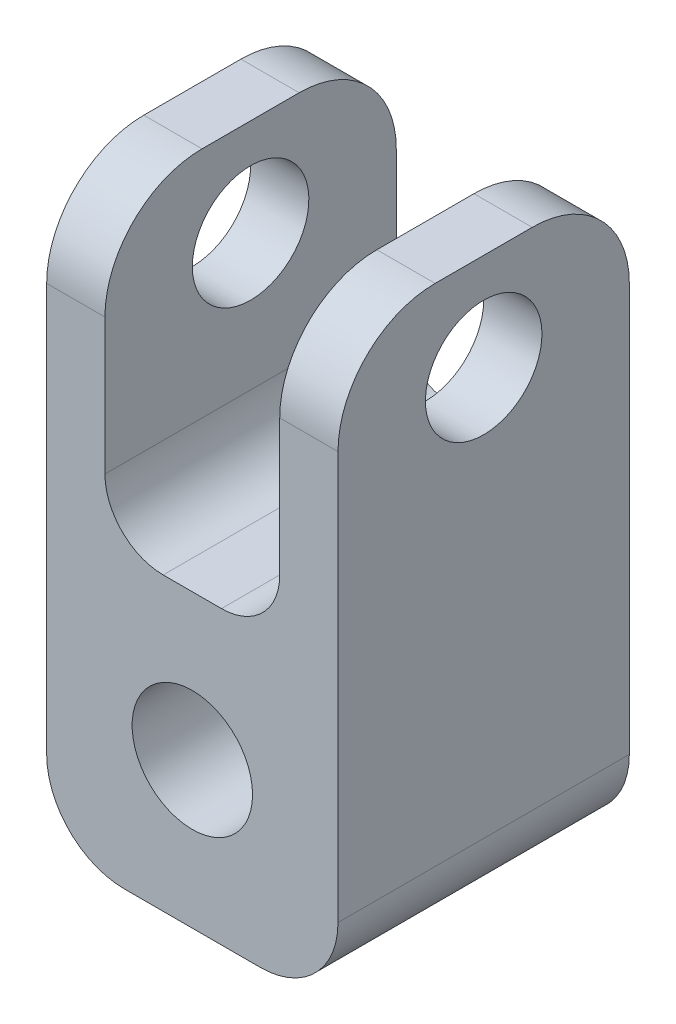
ISO-10303-21;
HEADER;
FILE_DESCRIPTION(('STEP AP214'),'2;1');
FILE_NAME('part.step','',(''),(''),'','','');
FILE_SCHEMA(('AUTOMOTIVE_DESIGN { 1 0 10303 214 1 1 1 1 }'));
ENDSEC;
DATA;
#1=APPLICATION_CONTEXT('core data for automotive mechanical design processes');
#2=APPLICATION_PROTOCOL_DEFINITION('international standard','automotive_design',2000,#1);
#3=PRODUCT_CONTEXT('',#1,'mechanical');
#4=PRODUCT('Part','Part','',(#3));
#5=PRODUCT_RELATED_PRODUCT_CATEGORY('part','',(#4));
#6=PRODUCT_DEFINITION_FORMATION('','',#4);
#7=PRODUCT_DEFINITION_CONTEXT('part definition',#1,'design');
#8=PRODUCT_DEFINITION('design','',#6,#7);
#9=PRODUCT_DEFINITION_SHAPE('','',#8);
#10=(LENGTH_UNIT() NAMED_UNIT(*) SI_UNIT(.MILLI.,.METRE.));
#11=(NAMED_UNIT(*) PLANE_ANGLE_UNIT() SI_UNIT($,.RADIAN.));
#12=(NAMED_UNIT(*) SI_UNIT($,.STERADIAN.) SOLID_ANGLE_UNIT());
#13=UNCERTAINTY_MEASURE_WITH_UNIT(LENGTH_MEASURE(1.E-05),#10,'distance_accuracy_value','');
#14=(GEOMETRIC_REPRESENTATION_CONTEXT(3) GLOBAL_UNCERTAINTY_ASSIGNED_CONTEXT((#13)) GLOBAL_UNIT_ASSIGNED_CONTEXT((#10,
#11,#12)) REPRESENTATION_CONTEXT('',''));
#15=CARTESIAN_POINT('',(0.,0.,0.));
#16=DIRECTION('',(0.,0.,1.));
#17=DIRECTION('',(1.,0.,0.));
#18=AXIS2_PLACEMENT_3D('',#15,#16,#17);
#19=CARTESIAN_POINT('',(-15.,15.,30.));
#20=DIRECTION('',(0.,-1.,0.));
#21=DIRECTION('',(0.,0.,-1.));
#22=AXIS2_PLACEMENT_3D('',#19,#20,#21);
#23=PLANE('',#22);
#24=DIRECTION('',(-1.,0.,0.));
#25=VECTOR('',#24,1.);
#26=CARTESIAN_POINT('',(-15.,15.,30.));
#27=LINE('',#26,#25);
#28=CARTESIAN_POINT('',(3.,15.,30.));
#29=VERTEX_POINT('',#28);
#30=CARTESIAN_POINT('',(-3.,15.,30.));
#31=VERTEX_POINT('',#30);
#32=EDGE_CURVE('E276',#29,#31,#27,.T.);
#33=ORIENTED_EDGE('',*,*,#32,.F.);
#34=DIRECTION('',(0.,0.,1.));
#35=VECTOR('',#34,1.);
#36=CARTESIAN_POINT('',(2.99999999999999,15.,0.));
#37=LINE('',#36,#35);
#38=CARTESIAN_POINT('',(2.99999999999999,15.,0.));
#39=VERTEX_POINT('',#38);
#40=EDGE_CURVE('E247',#29,#39,#37,.F.);
#41=ORIENTED_EDGE('',*,*,#40,.T.);
#42=DIRECTION('',(-1.,0.,0.));
#43=VECTOR('',#42,1.);
#44=CARTESIAN_POINT('',(-15.,15.,0.));
#45=LINE('',#44,#43);
#46=CARTESIAN_POINT('',(-3.,15.,0.));
#47=VERTEX_POINT('',#46);
#48=EDGE_CURVE('E175',#39,#47,#45,.T.);
#49=ORIENTED_EDGE('',*,*,#48,.T.);
#50=DIRECTION('',(0.,0.,-1.));
#51=VECTOR('',#50,1.);
#52=CARTESIAN_POINT('',(-3.,15.,30.));
#53=LINE('',#52,#51);
#54=EDGE_CURVE('E245',#47,#31,#53,.F.);
#55=ORIENTED_EDGE('',*,*,#54,.T.);
#56=EDGE_LOOP('',(#33,#41,#49,#55));
#57=FACE_BOUND('',#56,.T.);
#58=ADVANCED_FACE('F33',(#57),#23,.F.);
#59=CARTESIAN_POINT('',(0.,0.,30.));
#60=DIRECTION('',(0.,0.,1.));
#61=DIRECTION('',(1.,0.,0.));
#62=AXIS2_PLACEMENT_3D('',#59,#60,#61);
#63=PLANE('',#62);
#64=DIRECTION('',(0.,1.,0.));
#65=VECTOR('',#64,1.);
#66=CARTESIAN_POINT('',(15.,15.,30.));
#67=LINE('',#66,#65);
#68=CARTESIAN_POINT('',(15.,-7.,30.));
#69=VERTEX_POINT('',#68);
#70=CARTESIAN_POINT('',(15.,35.,30.));
#71=VERTEX_POINT('',#70);
#72=EDGE_CURVE('E167',#69,#71,#67,.T.);
#73=ORIENTED_EDGE('',*,*,#72,.T.);
#74=DIRECTION('',(1.,0.,0.));
#75=VECTOR('',#74,1.);
#76=CARTESIAN_POINT('',(0.,35.,30.));
#77=LINE('',#76,#75);
#78=CARTESIAN_POINT('',(9.,35.,30.));
#79=VERTEX_POINT('',#78);
#80=EDGE_CURVE('E214',#71,#79,#77,.F.);
#81=ORIENTED_EDGE('',*,*,#80,.T.);
#82=DIRECTION('',(0.,-1.,0.));
#83=VECTOR('',#82,1.);
#84=CARTESIAN_POINT('',(9.,45.,30.));
#85=LINE('',#84,#83);
#86=CARTESIAN_POINT('',(9.,21.,30.));
#87=VERTEX_POINT('',#86);
#88=EDGE_CURVE('E303',#79,#87,#85,.T.);
#89=ORIENTED_EDGE('',*,*,#88,.T.);
#90=CARTESIAN_POINT('',(3.,21.,30.));
#91=DIRECTION('',(0.,0.,1.));
#92=DIRECTION('',(1.,0.,0.));
#93=AXIS2_PLACEMENT_3D('',#90,#91,#92);
#94=CIRCLE('',#93,6.);
#95=EDGE_CURVE('E251',#87,#29,#94,.F.);
#96=ORIENTED_EDGE('',*,*,#95,.T.);
#97=ORIENTED_EDGE('',*,*,#32,.T.);
#98=CARTESIAN_POINT('',(-3.,21.,30.));
#99=DIRECTION('',(0.,0.,1.));
#100=DIRECTION('',(1.,0.,0.));
#101=AXIS2_PLACEMENT_3D('',#98,#99,#100);
#102=CIRCLE('',#101,6.);
#103=CARTESIAN_POINT('',(-9.00000000000001,21.,30.));
#104=VERTEX_POINT('',#103);
#105=EDGE_CURVE('E11',#31,#104,#102,.F.);
#106=ORIENTED_EDGE('',*,*,#105,.T.);
#107=DIRECTION('',(0.,-1.,0.));
#108=VECTOR('',#107,1.);
#109=CARTESIAN_POINT('',(-9.00000000000001,45.,30.));
#110=LINE('',#109,#108);
#111=CARTESIAN_POINT('',(-9.00000000000001,35.,30.));
#112=VERTEX_POINT('',#111);
#113=EDGE_CURVE('E265',#112,#104,#110,.T.);
#114=ORIENTED_EDGE('',*,*,#113,.F.);
#115=DIRECTION('',(1.,0.,0.));
#116=VECTOR('',#115,1.);
#117=CARTESIAN_POINT('',(0.,35.,30.));
#118=LINE('',#117,#116);
#119=CARTESIAN_POINT('',(-15.,35.,30.));
#120=VERTEX_POINT('',#119);
#121=EDGE_CURVE('E212',#112,#120,#118,.F.);
#122=ORIENTED_EDGE('',*,*,#121,.T.);
#123=DIRECTION('',(0.,-1.,0.));
#124=VECTOR('',#123,1.);
#125=CARTESIAN_POINT('',(-15.,15.,30.));
#126=LINE('',#125,#124);
#127=CARTESIAN_POINT('',(-15.,-7.,30.));
#128=VERTEX_POINT('',#127);
#129=EDGE_CURVE('E277',#120,#128,#126,.T.);
#130=ORIENTED_EDGE('',*,*,#129,.T.);
#131=CARTESIAN_POINT('',(-7.,-7.,30.));
#132=DIRECTION('',(0.,0.,1.));
#133=DIRECTION('',(1.,0.,0.));
#134=AXIS2_PLACEMENT_3D('',#131,#132,#133);
#135=CIRCLE('',#134,8.);
#136=CARTESIAN_POINT('',(-7.,-15.,30.));
#137=VERTEX_POINT('',#136);
#138=EDGE_CURVE('E195',#128,#137,#135,.T.);
#139=ORIENTED_EDGE('',*,*,#138,.T.);
#140=DIRECTION('',(1.,0.,0.));
#141=VECTOR('',#140,1.);
#142=CARTESIAN_POINT('',(-15.,-15.,30.));
#143=LINE('',#142,#141);
#144=CARTESIAN_POINT('',(7.,-15.,30.));
#145=VERTEX_POINT('',#144);
#146=EDGE_CURVE('E168',#137,#145,#143,.T.);
#147=ORIENTED_EDGE('',*,*,#146,.T.);
#148=CARTESIAN_POINT('',(7.,-7.,30.));
#149=DIRECTION('',(0.,0.,1.));
#150=DIRECTION('',(1.,0.,0.));
#151=AXIS2_PLACEMENT_3D('',#148,#149,#150);
#152=CIRCLE('',#151,8.);
#153=EDGE_CURVE('E197',#145,#69,#152,.T.);
#154=ORIENTED_EDGE('',*,*,#153,.T.);
#155=EDGE_LOOP('',(#73,#81,#89,#96,#97,#106,#114,#122,#130,#139,#147,#154));
#156=FACE_BOUND('',#155,.T.);
#157=CARTESIAN_POINT('',(0.,0.,30.));
#158=DIRECTION('',(0.,0.,1.));
#159=DIRECTION('',(1.,0.,0.));
#160=AXIS2_PLACEMENT_3D('',#157,#158,#159);
#161=CIRCLE('',#160,6.2);
#162=CARTESIAN_POINT('',(6.19999999999999,0.,30.));
#163=VERTEX_POINT('',#162);
#164=EDGE_CURVE('E176',#163,#163,#161,.T.);
#165=ORIENTED_EDGE('',*,*,#164,.F.);
#166=EDGE_LOOP('',(#165));
#167=FACE_BOUND('',#166,.T.);
#168=ADVANCED_FACE('F281',(#156,#167),#63,.T.);
#169=CARTESIAN_POINT('',(0.,0.,0.));
#170=DIRECTION('',(0.,0.,1.));
#171=DIRECTION('',(1.,0.,0.));
#172=AXIS2_PLACEMENT_3D('',#169,#170,#171);
#173=PLANE('',#172);
#174=DIRECTION('',(0.,-1.,0.));
#175=VECTOR('',#174,1.);
#176=CARTESIAN_POINT('',(8.99999999999999,45.,0.));
#177=LINE('',#176,#175);
#178=CARTESIAN_POINT('',(8.99999999999999,35.,0.));
#179=VERTEX_POINT('',#178);
#180=CARTESIAN_POINT('',(8.99999999999999,21.,0.));
#181=VERTEX_POINT('',#180);
#182=EDGE_CURVE('E308',#179,#181,#177,.T.);
#183=ORIENTED_EDGE('',*,*,#182,.F.);
#184=DIRECTION('',(-1.,0.,0.));
#185=VECTOR('',#184,1.);
#186=CARTESIAN_POINT('',(15.,35.,0.));
#187=LINE('',#186,#185);
#188=CARTESIAN_POINT('',(15.,35.,0.));
#189=VERTEX_POINT('',#188);
#190=EDGE_CURVE('E174',#179,#189,#187,.F.);
#191=ORIENTED_EDGE('',*,*,#190,.T.);
#192=DIRECTION('',(0.,1.,0.));
#193=VECTOR('',#192,1.);
#194=CARTESIAN_POINT('',(15.,15.,0.));
#195=LINE('',#194,#193);
#196=CARTESIAN_POINT('',(15.,-7.,0.));
#197=VERTEX_POINT('',#196);
#198=EDGE_CURVE('E164',#197,#189,#195,.T.);
#199=ORIENTED_EDGE('',*,*,#198,.F.);
#200=CARTESIAN_POINT('',(7.,-7.,0.));
#201=DIRECTION('',(0.,0.,1.));
#202=DIRECTION('',(1.,0.,0.));
#203=AXIS2_PLACEMENT_3D('',#200,#201,#202);
#204=CIRCLE('',#203,8.);
#205=CARTESIAN_POINT('',(7.,-15.,0.));
#206=VERTEX_POINT('',#205);
#207=EDGE_CURVE('E146',#197,#206,#204,.F.);
#208=ORIENTED_EDGE('',*,*,#207,.T.);
#209=DIRECTION('',(1.,0.,0.));
#210=VECTOR('',#209,1.);
#211=CARTESIAN_POINT('',(-15.,-15.,0.));
#212=LINE('',#211,#210);
#213=CARTESIAN_POINT('',(-7.,-15.,0.));
#214=VERTEX_POINT('',#213);
#215=EDGE_CURVE('E188',#214,#206,#212,.T.);
#216=ORIENTED_EDGE('',*,*,#215,.F.);
#217=CARTESIAN_POINT('',(-7.,-7.,0.));
#218=DIRECTION('',(0.,0.,1.));
#219=DIRECTION('',(1.,0.,0.));
#220=AXIS2_PLACEMENT_3D('',#217,#218,#219);
#221=CIRCLE('',#220,8.);
#222=CARTESIAN_POINT('',(-15.,-7.,0.));
#223=VERTEX_POINT('',#222);
#224=EDGE_CURVE('E157',#214,#223,#221,.F.);
#225=ORIENTED_EDGE('',*,*,#224,.T.);
#226=DIRECTION('',(0.,-1.,0.));
#227=VECTOR('',#226,1.);
#228=CARTESIAN_POINT('',(-15.,15.,0.));
#229=LINE('',#228,#227);
#230=CARTESIAN_POINT('',(-15.,35.,0.));
#231=VERTEX_POINT('',#230);
#232=EDGE_CURVE('E179',#231,#223,#229,.T.);
#233=ORIENTED_EDGE('',*,*,#232,.F.);
#234=DIRECTION('',(-1.,0.,0.));
#235=VECTOR('',#234,1.);
#236=CARTESIAN_POINT('',(-9.00000000000001,35.,0.));
#237=LINE('',#236,#235);
#238=CARTESIAN_POINT('',(-9.00000000000001,35.,0.));
#239=VERTEX_POINT('',#238);
#240=EDGE_CURVE('E220',#231,#239,#237,.F.);
#241=ORIENTED_EDGE('',*,*,#240,.T.);
#242=DIRECTION('',(0.,-1.,0.));
#243=VECTOR('',#242,1.);
#244=CARTESIAN_POINT('',(-9.00000000000001,45.,0.));
#245=LINE('',#244,#243);
#246=CARTESIAN_POINT('',(-9.00000000000001,21.,0.));
#247=VERTEX_POINT('',#246);
#248=EDGE_CURVE('E258',#239,#247,#245,.T.);
#249=ORIENTED_EDGE('',*,*,#248,.T.);
#250=CARTESIAN_POINT('',(-3.,21.,0.));
#251=DIRECTION('',(0.,0.,1.));
#252=DIRECTION('',(1.,0.,0.));
#253=AXIS2_PLACEMENT_3D('',#250,#251,#252);
#254=CIRCLE('',#253,6.);
#255=EDGE_CURVE('E41',#247,#47,#254,.T.);
#256=ORIENTED_EDGE('',*,*,#255,.T.);
#257=ORIENTED_EDGE('',*,*,#48,.F.);
#258=CARTESIAN_POINT('',(2.99999999999999,21.,0.));
#259=DIRECTION('',(0.,0.,1.));
#260=DIRECTION('',(1.,0.,0.));
#261=AXIS2_PLACEMENT_3D('',#258,#259,#260);
#262=CIRCLE('',#261,6.);
#263=EDGE_CURVE('E253',#39,#181,#262,.T.);
#264=ORIENTED_EDGE('',*,*,#263,.T.);
#265=EDGE_LOOP('',(#183,#191,#199,#208,#216,#225,#233,#241,#249,#256,#257,#264));
#266=FACE_BOUND('',#265,.T.);
#267=CARTESIAN_POINT('',(0.,0.,0.));
#268=DIRECTION('',(0.,0.,1.));
#269=DIRECTION('',(1.,0.,0.));
#270=AXIS2_PLACEMENT_3D('',#267,#268,#269);
#271=CIRCLE('',#270,6.2);
#272=CARTESIAN_POINT('',(6.19999999999999,0.,0.));
#273=VERTEX_POINT('',#272);
#274=EDGE_CURVE('E182',#273,#273,#271,.T.);
#275=ORIENTED_EDGE('',*,*,#274,.T.);
#276=EDGE_LOOP('',(#275));
#277=FACE_BOUND('',#276,.T.);
#278=ADVANCED_FACE('F171',(#266,#277),#173,.F.);
#279=CARTESIAN_POINT('',(15.,15.,30.));
#280=DIRECTION('',(-1.,0.,0.));
#281=DIRECTION('',(0.,-1.,0.));
#282=AXIS2_PLACEMENT_3D('',#279,#280,#281);
#283=PLANE('',#282);
#284=CARTESIAN_POINT('',(15.,35.,15.));
#285=DIRECTION('',(-1.,0.,0.));
#286=DIRECTION('',(0.,-1.,0.));
#287=AXIS2_PLACEMENT_3D('',#284,#285,#286);
#288=CIRCLE('',#287,6.);
#289=CARTESIAN_POINT('',(15.,29.,15.));
#290=VERTEX_POINT('',#289);
#291=EDGE_CURVE('E242',#290,#290,#288,.T.);
#292=ORIENTED_EDGE('',*,*,#291,.T.);
#293=EDGE_LOOP('',(#292));
#294=FACE_BOUND('',#293,.T.);
#295=DIRECTION('',(0.,0.,-1.));
#296=VECTOR('',#295,1.);
#297=CARTESIAN_POINT('',(15.,45.,30.));
#298=LINE('',#297,#296);
#299=CARTESIAN_POINT('',(15.,45.,20.));
#300=VERTEX_POINT('',#299);
#301=CARTESIAN_POINT('',(15.,45.,10.));
#302=VERTEX_POINT('',#301);
#303=EDGE_CURVE('E311',#300,#302,#298,.T.);
#304=ORIENTED_EDGE('',*,*,#303,.F.);
#305=CARTESIAN_POINT('',(15.,35.,20.));
#306=DIRECTION('',(-1.,0.,0.));
#307=DIRECTION('',(0.,-1.,0.));
#308=AXIS2_PLACEMENT_3D('',#305,#306,#307);
#309=CIRCLE('',#308,10.);
#310=EDGE_CURVE('E210',#300,#71,#309,.F.);
#311=ORIENTED_EDGE('',*,*,#310,.T.);
#312=ORIENTED_EDGE('',*,*,#72,.F.);
#313=DIRECTION('',(0.,0.,-1.));
#314=VECTOR('',#313,1.);
#315=CARTESIAN_POINT('',(15.,-7.,30.));
#316=LINE('',#315,#314);
#317=EDGE_CURVE('E150',#69,#197,#316,.T.);
#318=ORIENTED_EDGE('',*,*,#317,.T.);
#319=ORIENTED_EDGE('',*,*,#198,.T.);
#320=CARTESIAN_POINT('',(15.,35.,10.));
#321=DIRECTION('',(-1.,0.,0.));
#322=DIRECTION('',(0.,-1.,0.));
#323=AXIS2_PLACEMENT_3D('',#320,#321,#322);
#324=CIRCLE('',#323,10.);
#325=EDGE_CURVE('E208',#189,#302,#324,.F.);
#326=ORIENTED_EDGE('',*,*,#325,.T.);
#327=EDGE_LOOP('',(#304,#311,#312,#318,#319,#326));
#328=FACE_BOUND('',#327,.T.);
#329=ADVANCED_FACE('F163',(#294,#328),#283,.F.);
#330=CARTESIAN_POINT('',(-15.,15.,30.));
#331=DIRECTION('',(1.,0.,0.));
#332=DIRECTION('',(0.,1.,0.));
#333=AXIS2_PLACEMENT_3D('',#330,#331,#332);
#334=PLANE('',#333);
#335=CARTESIAN_POINT('',(-15.,35.,15.));
#336=DIRECTION('',(-1.,0.,0.));
#337=DIRECTION('',(0.,-1.,0.));
#338=AXIS2_PLACEMENT_3D('',#335,#336,#337);
#339=CIRCLE('',#338,6.);
#340=CARTESIAN_POINT('',(-15.,29.,15.));
#341=VERTEX_POINT('',#340);
#342=EDGE_CURVE('E319',#341,#341,#339,.T.);
#343=ORIENTED_EDGE('',*,*,#342,.F.);
#344=EDGE_LOOP('',(#343));
#345=FACE_BOUND('',#344,.T.);
#346=DIRECTION('',(0.,0.,1.));
#347=VECTOR('',#346,1.);
#348=CARTESIAN_POINT('',(-15.,45.,0.));
#349=LINE('',#348,#347);
#350=CARTESIAN_POINT('',(-15.,45.,10.));
#351=VERTEX_POINT('',#350);
#352=CARTESIAN_POINT('',(-15.,45.,20.));
#353=VERTEX_POINT('',#352);
#354=EDGE_CURVE('E302',#351,#353,#349,.T.);
#355=ORIENTED_EDGE('',*,*,#354,.F.);
#356=CARTESIAN_POINT('',(-15.,35.,10.));
#357=DIRECTION('',(1.,0.,0.));
#358=DIRECTION('',(0.,1.,0.));
#359=AXIS2_PLACEMENT_3D('',#356,#357,#358);
#360=CIRCLE('',#359,10.);
#361=EDGE_CURVE('E231',#351,#231,#360,.F.);
#362=ORIENTED_EDGE('',*,*,#361,.T.);
#363=ORIENTED_EDGE('',*,*,#232,.T.);
#364=DIRECTION('',(0.,0.,-1.));
#365=VECTOR('',#364,1.);
#366=CARTESIAN_POINT('',(-15.,-7.,30.));
#367=LINE('',#366,#365);
#368=EDGE_CURVE('E199',#223,#128,#367,.F.);
#369=ORIENTED_EDGE('',*,*,#368,.T.);
#370=ORIENTED_EDGE('',*,*,#129,.F.);
#371=CARTESIAN_POINT('',(-15.,35.,20.));
#372=DIRECTION('',(1.,0.,0.));
#373=DIRECTION('',(0.,1.,0.));
#374=AXIS2_PLACEMENT_3D('',#371,#372,#373);
#375=CIRCLE('',#374,10.);
#376=EDGE_CURVE('E229',#120,#353,#375,.F.);
#377=ORIENTED_EDGE('',*,*,#376,.T.);
#378=EDGE_LOOP('',(#355,#362,#363,#369,#370,#377));
#379=FACE_BOUND('',#378,.T.);
#380=ADVANCED_FACE('F369',(#345,#379),#334,.F.);
#381=CARTESIAN_POINT('',(-15.,-15.,30.));
#382=DIRECTION('',(0.,1.,0.));
#383=DIRECTION('',(0.,0.,1.));
#384=AXIS2_PLACEMENT_3D('',#381,#382,#383);
#385=PLANE('',#384);
#386=ORIENTED_EDGE('',*,*,#215,.T.);
#387=DIRECTION('',(0.,0.,-1.));
#388=VECTOR('',#387,1.);
#389=CARTESIAN_POINT('',(7.,-15.,30.));
#390=LINE('',#389,#388);
#391=EDGE_CURVE('E151',#206,#145,#390,.F.);
#392=ORIENTED_EDGE('',*,*,#391,.T.);
#393=ORIENTED_EDGE('',*,*,#146,.F.);
#394=DIRECTION('',(0.,0.,-1.));
#395=VECTOR('',#394,1.);
#396=CARTESIAN_POINT('',(-7.,-15.,30.));
#397=LINE('',#396,#395);
#398=EDGE_CURVE('E156',#137,#214,#397,.T.);
#399=ORIENTED_EDGE('',*,*,#398,.T.);
#400=EDGE_LOOP('',(#386,#392,#393,#399));
#401=FACE_BOUND('',#400,.T.);
#402=ADVANCED_FACE('F286',(#401),#385,.F.);
#403=CARTESIAN_POINT('',(0.,0.,30.));
#404=DIRECTION('',(0.,0.,-1.));
#405=DIRECTION('',(-1.,0.,0.));
#406=AXIS2_PLACEMENT_3D('',#403,#404,#405);
#407=CYLINDRICAL_SURFACE('',#406,6.2);
#408=ORIENTED_EDGE('',*,*,#164,.T.);
#409=EDGE_LOOP('',(#408));
#410=FACE_BOUND('',#409,.T.);
#411=ORIENTED_EDGE('',*,*,#274,.F.);
#412=EDGE_LOOP('',(#411));
#413=FACE_BOUND('',#412,.T.);
#414=ADVANCED_FACE('F471',(#410,#413),#407,.F.);
#415=CARTESIAN_POINT('',(-9.00000000000001,45.,30.));
#416=DIRECTION('',(-1.,0.,0.));
#417=DIRECTION('',(0.,0.,1.));
#418=AXIS2_PLACEMENT_3D('',#415,#416,#417);
#419=PLANE('',#418);
#420=CARTESIAN_POINT('',(-9.00000000000001,35.,15.));
#421=DIRECTION('',(-1.,0.,0.));
#422=DIRECTION('',(0.,0.,1.));
#423=AXIS2_PLACEMENT_3D('',#420,#421,#422);
#424=CIRCLE('',#423,6.);
#425=CARTESIAN_POINT('',(-9.00000000000001,35.,21.));
#426=VERTEX_POINT('',#425);
#427=EDGE_CURVE('E241',#426,#426,#424,.T.);
#428=ORIENTED_EDGE('',*,*,#427,.T.);
#429=EDGE_LOOP('',(#428));
#430=FACE_BOUND('',#429,.T.);
#431=ORIENTED_EDGE('',*,*,#113,.T.);
#432=DIRECTION('',(0.,0.,-1.));
#433=VECTOR('',#432,1.);
#434=CARTESIAN_POINT('',(-9.00000000000001,21.,0.));
#435=LINE('',#434,#433);
#436=EDGE_CURVE('E249',#104,#247,#435,.T.);
#437=ORIENTED_EDGE('',*,*,#436,.T.);
#438=ORIENTED_EDGE('',*,*,#248,.F.);
#439=CARTESIAN_POINT('',(-9.00000000000001,35.,10.));
#440=DIRECTION('',(-1.,0.,0.));
#441=DIRECTION('',(0.,0.,1.));
#442=AXIS2_PLACEMENT_3D('',#439,#440,#441);
#443=CIRCLE('',#442,10.);
#444=CARTESIAN_POINT('',(-9.00000000000001,45.,10.));
#445=VERTEX_POINT('',#444);
#446=EDGE_CURVE('E235',#239,#445,#443,.F.);
#447=ORIENTED_EDGE('',*,*,#446,.T.);
#448=DIRECTION('',(0.,0.,-1.));
#449=VECTOR('',#448,1.);
#450=CARTESIAN_POINT('',(-9.00000000000001,45.,30.));
#451=LINE('',#450,#449);
#452=CARTESIAN_POINT('',(-9.00000000000001,45.,20.));
#453=VERTEX_POINT('',#452);
#454=EDGE_CURVE('E271',#453,#445,#451,.T.);
#455=ORIENTED_EDGE('',*,*,#454,.F.);
#456=CARTESIAN_POINT('',(-9.00000000000001,35.,20.));
#457=DIRECTION('',(-1.,0.,0.));
#458=DIRECTION('',(0.,0.,1.));
#459=AXIS2_PLACEMENT_3D('',#456,#457,#458);
#460=CIRCLE('',#459,10.);
#461=EDGE_CURVE('E233',#453,#112,#460,.F.);
#462=ORIENTED_EDGE('',*,*,#461,.T.);
#463=EDGE_LOOP('',(#431,#437,#438,#447,#455,#462));
#464=FACE_BOUND('',#463,.T.);
#465=ADVANCED_FACE('F263',(#430,#464),#419,.F.);
#466=CARTESIAN_POINT('',(0.,45.,0.));
#467=DIRECTION('',(0.,1.,0.));
#468=DIRECTION('',(0.,0.,1.));
#469=AXIS2_PLACEMENT_3D('',#466,#467,#468);
#470=PLANE('',#469);
#471=ORIENTED_EDGE('',*,*,#454,.T.);
#472=DIRECTION('',(-1.,0.,0.));
#473=VECTOR('',#472,1.);
#474=CARTESIAN_POINT('',(-15.,45.,10.));
#475=LINE('',#474,#473);
#476=EDGE_CURVE('E226',#445,#351,#475,.T.);
#477=ORIENTED_EDGE('',*,*,#476,.T.);
#478=ORIENTED_EDGE('',*,*,#354,.T.);
#479=DIRECTION('',(1.,0.,0.));
#480=VECTOR('',#479,1.);
#481=CARTESIAN_POINT('',(0.,45.,20.));
#482=LINE('',#481,#480);
#483=EDGE_CURVE('E223',#353,#453,#482,.T.);
#484=ORIENTED_EDGE('',*,*,#483,.T.);
#485=EDGE_LOOP('',(#471,#477,#478,#484));
#486=FACE_BOUND('',#485,.T.);
#487=ADVANCED_FACE('F298',(#486),#470,.T.);
#488=CARTESIAN_POINT('',(8.99999999999999,45.,0.));
#489=DIRECTION('',(1.,0.,0.));
#490=DIRECTION('',(0.,0.,-1.));
#491=AXIS2_PLACEMENT_3D('',#488,#489,#490);
#492=PLANE('',#491);
#493=CARTESIAN_POINT('',(9.,35.,15.));
#494=DIRECTION('',(1.,0.,0.));
#495=DIRECTION('',(0.,0.,-1.));
#496=AXIS2_PLACEMENT_3D('',#493,#494,#495);
#497=CIRCLE('',#496,6.);
#498=CARTESIAN_POINT('',(9.,35.,9.));
#499=VERTEX_POINT('',#498);
#500=EDGE_CURVE('E238',#499,#499,#497,.T.);
#501=ORIENTED_EDGE('',*,*,#500,.T.);
#502=EDGE_LOOP('',(#501));
#503=FACE_BOUND('',#502,.T.);
#504=ORIENTED_EDGE('',*,*,#182,.T.);
#505=DIRECTION('',(0.,0.,1.));
#506=VECTOR('',#505,1.);
#507=CARTESIAN_POINT('',(9.,21.,30.));
#508=LINE('',#507,#506);
#509=EDGE_CURVE('E237',#181,#87,#508,.T.);
#510=ORIENTED_EDGE('',*,*,#509,.T.);
#511=ORIENTED_EDGE('',*,*,#88,.F.);
#512=CARTESIAN_POINT('',(9.,35.,20.));
#513=DIRECTION('',(1.,0.,0.));
#514=DIRECTION('',(0.,0.,-1.));
#515=AXIS2_PLACEMENT_3D('',#512,#513,#514);
#516=CIRCLE('',#515,10.);
#517=CARTESIAN_POINT('',(9.,45.,20.));
#518=VERTEX_POINT('',#517);
#519=EDGE_CURVE('E218',#79,#518,#516,.F.);
#520=ORIENTED_EDGE('',*,*,#519,.T.);
#521=DIRECTION('',(0.,0.,1.));
#522=VECTOR('',#521,1.);
#523=CARTESIAN_POINT('',(8.99999999999999,45.,0.));
#524=LINE('',#523,#522);
#525=CARTESIAN_POINT('',(9.,45.,10.));
#526=VERTEX_POINT('',#525);
#527=EDGE_CURVE('E314',#526,#518,#524,.T.);
#528=ORIENTED_EDGE('',*,*,#527,.F.);
#529=CARTESIAN_POINT('',(9.,35.,10.));
#530=DIRECTION('',(1.,0.,0.));
#531=DIRECTION('',(0.,0.,-1.));
#532=AXIS2_PLACEMENT_3D('',#529,#530,#531);
#533=CIRCLE('',#532,10.);
#534=EDGE_CURVE('E216',#526,#179,#533,.F.);
#535=ORIENTED_EDGE('',*,*,#534,.T.);
#536=EDGE_LOOP('',(#504,#510,#511,#520,#528,#535));
#537=FACE_BOUND('',#536,.T.);
#538=ADVANCED_FACE('F334',(#503,#537),#492,.F.);
#539=CARTESIAN_POINT('',(0.,45.,0.));
#540=DIRECTION('',(0.,1.,0.));
#541=DIRECTION('',(0.,0.,1.));
#542=AXIS2_PLACEMENT_3D('',#539,#540,#541);
#543=PLANE('',#542);
#544=ORIENTED_EDGE('',*,*,#527,.T.);
#545=DIRECTION('',(1.,0.,0.));
#546=VECTOR('',#545,1.);
#547=CARTESIAN_POINT('',(0.,45.,20.));
#548=LINE('',#547,#546);
#549=EDGE_CURVE('E205',#518,#300,#548,.T.);
#550=ORIENTED_EDGE('',*,*,#549,.T.);
#551=ORIENTED_EDGE('',*,*,#303,.T.);
#552=DIRECTION('',(-1.,0.,0.));
#553=VECTOR('',#552,1.);
#554=CARTESIAN_POINT('',(8.99999999999999,45.,10.));
#555=LINE('',#554,#553);
#556=EDGE_CURVE('E202',#302,#526,#555,.T.);
#557=ORIENTED_EDGE('',*,*,#556,.T.);
#558=EDGE_LOOP('',(#544,#550,#551,#557));
#559=FACE_BOUND('',#558,.T.);
#560=ADVANCED_FACE('F337',(#559),#543,.T.);
#561=CARTESIAN_POINT('',(7.,-7.,30.));
#562=DIRECTION('',(0.,0.,-1.));
#563=DIRECTION('',(-1.,0.,0.));
#564=AXIS2_PLACEMENT_3D('',#561,#562,#563);
#565=CYLINDRICAL_SURFACE('',#564,8.);
#566=ORIENTED_EDGE('',*,*,#153,.F.);
#567=ORIENTED_EDGE('',*,*,#391,.F.);
#568=ORIENTED_EDGE('',*,*,#207,.F.);
#569=ORIENTED_EDGE('',*,*,#317,.F.);
#570=EDGE_LOOP('',(#566,#567,#568,#569));
#571=FACE_BOUND('',#570,.T.);
#572=ADVANCED_FACE('F149',(#571),#565,.T.);
#573=CARTESIAN_POINT('',(-7.,-7.,30.));
#574=DIRECTION('',(0.,0.,-1.));
#575=DIRECTION('',(-1.,0.,0.));
#576=AXIS2_PLACEMENT_3D('',#573,#574,#575);
#577=CYLINDRICAL_SURFACE('',#576,8.);
#578=ORIENTED_EDGE('',*,*,#138,.F.);
#579=ORIENTED_EDGE('',*,*,#368,.F.);
#580=ORIENTED_EDGE('',*,*,#224,.F.);
#581=ORIENTED_EDGE('',*,*,#398,.F.);
#582=EDGE_LOOP('',(#578,#579,#580,#581));
#583=FACE_BOUND('',#582,.T.);
#584=ADVANCED_FACE('F288',(#583),#577,.T.);
#585=CARTESIAN_POINT('',(0.,35.,20.));
#586=DIRECTION('',(1.,0.,0.));
#587=DIRECTION('',(0.,0.,-1.));
#588=AXIS2_PLACEMENT_3D('',#585,#586,#587);
#589=CYLINDRICAL_SURFACE('',#588,10.);
#590=ORIENTED_EDGE('',*,*,#519,.F.);
#591=ORIENTED_EDGE('',*,*,#80,.F.);
#592=ORIENTED_EDGE('',*,*,#310,.F.);
#593=ORIENTED_EDGE('',*,*,#549,.F.);
#594=EDGE_LOOP('',(#590,#591,#592,#593));
#595=FACE_BOUND('',#594,.T.);
#596=ADVANCED_FACE('F348',(#595),#589,.T.);
#597=CARTESIAN_POINT('',(0.,35.,10.));
#598=DIRECTION('',(1.,0.,0.));
#599=DIRECTION('',(0.,0.,-1.));
#600=AXIS2_PLACEMENT_3D('',#597,#598,#599);
#601=CYLINDRICAL_SURFACE('',#600,10.);
#602=ORIENTED_EDGE('',*,*,#325,.F.);
#603=ORIENTED_EDGE('',*,*,#190,.F.);
#604=ORIENTED_EDGE('',*,*,#534,.F.);
#605=ORIENTED_EDGE('',*,*,#556,.F.);
#606=EDGE_LOOP('',(#602,#603,#604,#605));
#607=FACE_BOUND('',#606,.T.);
#608=ADVANCED_FACE('F352',(#607),#601,.T.);
#609=CARTESIAN_POINT('',(0.,35.,10.));
#610=DIRECTION('',(1.,0.,0.));
#611=DIRECTION('',(0.,0.,-1.));
#612=AXIS2_PLACEMENT_3D('',#609,#610,#611);
#613=CYLINDRICAL_SURFACE('',#612,10.);
#614=ORIENTED_EDGE('',*,*,#446,.F.);
#615=ORIENTED_EDGE('',*,*,#240,.F.);
#616=ORIENTED_EDGE('',*,*,#361,.F.);
#617=ORIENTED_EDGE('',*,*,#476,.F.);
#618=EDGE_LOOP('',(#614,#615,#616,#617));
#619=FACE_BOUND('',#618,.T.);
#620=ADVANCED_FACE('F294',(#619),#613,.T.);
#621=CARTESIAN_POINT('',(0.,35.,20.));
#622=DIRECTION('',(1.,0.,0.));
#623=DIRECTION('',(0.,0.,-1.));
#624=AXIS2_PLACEMENT_3D('',#621,#622,#623);
#625=CYLINDRICAL_SURFACE('',#624,10.);
#626=ORIENTED_EDGE('',*,*,#376,.F.);
#627=ORIENTED_EDGE('',*,*,#121,.F.);
#628=ORIENTED_EDGE('',*,*,#461,.F.);
#629=ORIENTED_EDGE('',*,*,#483,.F.);
#630=EDGE_LOOP('',(#626,#627,#628,#629));
#631=FACE_BOUND('',#630,.T.);
#632=ADVANCED_FACE('F330',(#631),#625,.T.);
#633=CARTESIAN_POINT('',(15.,35.,15.));
#634=DIRECTION('',(-1.,0.,0.));
#635=DIRECTION('',(0.,-1.,0.));
#636=AXIS2_PLACEMENT_3D('',#633,#634,#635);
#637=CYLINDRICAL_SURFACE('',#636,6.);
#638=ORIENTED_EDGE('',*,*,#291,.F.);
#639=EDGE_LOOP('',(#638));
#640=FACE_BOUND('',#639,.T.);
#641=ORIENTED_EDGE('',*,*,#500,.F.);
#642=EDGE_LOOP('',(#641));
#643=FACE_BOUND('',#642,.T.);
#644=ADVANCED_FACE('F326',(#640,#643),#637,.F.);
#645=ORIENTED_EDGE('',*,*,#342,.T.);
#646=EDGE_LOOP('',(#645));
#647=FACE_BOUND('',#646,.T.);
#648=ORIENTED_EDGE('',*,*,#427,.F.);
#649=EDGE_LOOP('',(#648));
#650=FACE_BOUND('',#649,.T.);
#651=ADVANCED_FACE('F329',(#647,#650),#637,.F.);
#652=CARTESIAN_POINT('',(2.99999999999999,21.,0.));
#653=DIRECTION('',(0.,0.,-1.));
#654=DIRECTION('',(-1.,0.,0.));
#655=AXIS2_PLACEMENT_3D('',#652,#653,#654);
#656=CYLINDRICAL_SURFACE('',#655,6.);
#657=ORIENTED_EDGE('',*,*,#263,.F.);
#658=ORIENTED_EDGE('',*,*,#40,.F.);
#659=ORIENTED_EDGE('',*,*,#95,.F.);
#660=ORIENTED_EDGE('',*,*,#509,.F.);
#661=EDGE_LOOP('',(#657,#658,#659,#660));
#662=FACE_BOUND('',#661,.T.);
#663=ADVANCED_FACE('F343',(#662),#656,.F.);
#664=CARTESIAN_POINT('',(-3.,21.,30.));
#665=DIRECTION('',(0.,0.,1.));
#666=DIRECTION('',(1.,0.,0.));
#667=AXIS2_PLACEMENT_3D('',#664,#665,#666);
#668=CYLINDRICAL_SURFACE('',#667,6.);
#669=ORIENTED_EDGE('',*,*,#105,.F.);
#670=ORIENTED_EDGE('',*,*,#54,.F.);
#671=ORIENTED_EDGE('',*,*,#255,.F.);
#672=ORIENTED_EDGE('',*,*,#436,.F.);
#673=EDGE_LOOP('',(#669,#670,#671,#672));
#674=FACE_BOUND('',#673,.T.);
#675=ADVANCED_FACE('F35',(#674),#668,.F.);
#676=CLOSED_SHELL('',(#58,#168,#278,#329,#380,#402,#414,#465,#487,#538,#560,#572,#584,#596,#608,
#620,#632,#644,#651,#663,#675));
#677=MANIFOLD_SOLID_BREP('B2',#676);
#678=ADVANCED_BREP_SHAPE_REPRESENTATION('',(#18,#677),#14);
#679=SHAPE_DEFINITION_REPRESENTATION(#9,#678);
ENDSEC;
END-ISO-10303-21;
